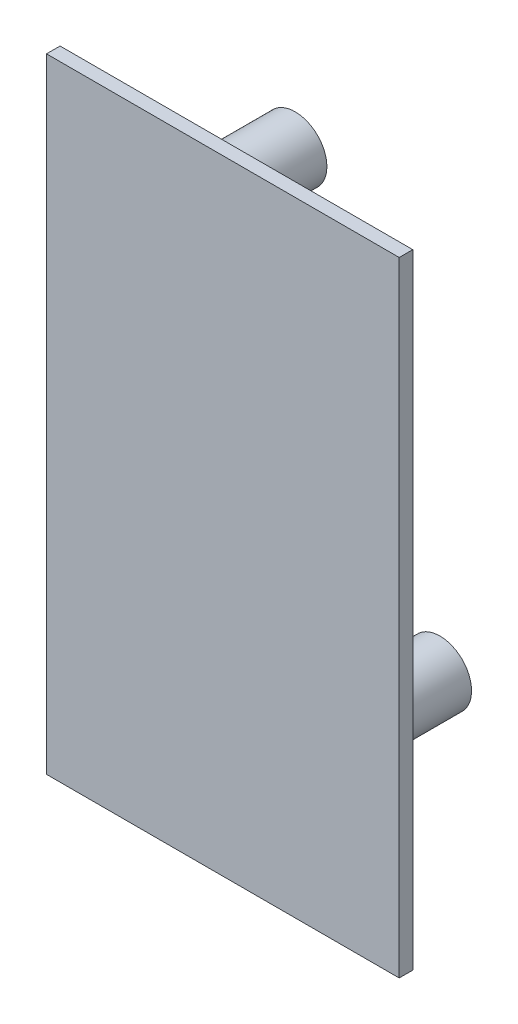
ISO-10303-21;
HEADER;
FILE_DESCRIPTION(('STEP AP214'),'2;1');
FILE_NAME('part.step','',(''),(''),'','','');
FILE_SCHEMA(('AUTOMOTIVE_DESIGN { 1 0 10303 214 1 1 1 1 }'));
ENDSEC;
DATA;
#1=APPLICATION_CONTEXT('core data for automotive mechanical design processes');
#2=APPLICATION_PROTOCOL_DEFINITION('international standard','automotive_design',2000,#1);
#3=PRODUCT_CONTEXT('',#1,'mechanical');
#4=PRODUCT('Part','Part','',(#3));
#5=PRODUCT_RELATED_PRODUCT_CATEGORY('part','',(#4));
#6=PRODUCT_DEFINITION_FORMATION('','',#4);
#7=PRODUCT_DEFINITION_CONTEXT('part definition',#1,'design');
#8=PRODUCT_DEFINITION('design','',#6,#7);
#9=PRODUCT_DEFINITION_SHAPE('','',#8);
#10=(LENGTH_UNIT() NAMED_UNIT(*) SI_UNIT(.MILLI.,.METRE.));
#11=(NAMED_UNIT(*) PLANE_ANGLE_UNIT() SI_UNIT($,.RADIAN.));
#12=(NAMED_UNIT(*) SI_UNIT($,.STERADIAN.) SOLID_ANGLE_UNIT());
#13=UNCERTAINTY_MEASURE_WITH_UNIT(LENGTH_MEASURE(1.E-05),#10,'distance_accuracy_value','');
#14=(GEOMETRIC_REPRESENTATION_CONTEXT(3) GLOBAL_UNCERTAINTY_ASSIGNED_CONTEXT((#13)) GLOBAL_UNIT_ASSIGNED_CONTEXT((#10,
#11,#12)) REPRESENTATION_CONTEXT('',''));
#15=CARTESIAN_POINT('',(0.,0.,0.));
#16=DIRECTION('',(0.,0.,1.));
#17=DIRECTION('',(1.,0.,0.));
#18=AXIS2_PLACEMENT_3D('',#15,#16,#17);
#19=CARTESIAN_POINT('',(0.,0.,1.5));
#20=DIRECTION('',(1.,0.,0.));
#21=DIRECTION('',(0.,1.,0.));
#22=AXIS2_PLACEMENT_3D('',#19,#20,#21);
#23=PLANE('',#22);
#24=DIRECTION('',(0.,-1.,0.));
#25=VECTOR('',#24,1.);
#26=CARTESIAN_POINT('',(0.,0.,0.));
#27=LINE('',#26,#25);
#28=CARTESIAN_POINT('',(0.,69.,0.));
#29=VERTEX_POINT('',#28);
#30=CARTESIAN_POINT('',(0.,0.,0.));
#31=VERTEX_POINT('',#30);
#32=EDGE_CURVE('E111',#29,#31,#27,.T.);
#33=ORIENTED_EDGE('',*,*,#32,.T.);
#34=DIRECTION('',(0.,0.,-1.));
#35=VECTOR('',#34,1.);
#36=CARTESIAN_POINT('',(0.,0.,1.5));
#37=LINE('',#36,#35);
#38=CARTESIAN_POINT('',(0.,0.,1.5));
#39=VERTEX_POINT('',#38);
#40=EDGE_CURVE('E100',#39,#31,#37,.T.);
#41=ORIENTED_EDGE('',*,*,#40,.F.);
#42=DIRECTION('',(0.,-1.,0.));
#43=VECTOR('',#42,1.);
#44=CARTESIAN_POINT('',(0.,0.,1.5));
#45=LINE('',#44,#43);
#46=CARTESIAN_POINT('',(0.,69.,1.5));
#47=VERTEX_POINT('',#46);
#48=EDGE_CURVE('E92',#47,#39,#45,.T.);
#49=ORIENTED_EDGE('',*,*,#48,.F.);
#50=DIRECTION('',(0.,0.,-1.));
#51=VECTOR('',#50,1.);
#52=CARTESIAN_POINT('',(0.,69.,1.5));
#53=LINE('',#52,#51);
#54=EDGE_CURVE('E107',#47,#29,#53,.T.);
#55=ORIENTED_EDGE('',*,*,#54,.T.);
#56=EDGE_LOOP('',(#33,#41,#49,#55));
#57=FACE_BOUND('',#56,.T.);
#58=ADVANCED_FACE('F39',(#57),#23,.F.);
#59=CARTESIAN_POINT('',(0.,0.,1.5));
#60=DIRECTION('',(0.,1.,0.));
#61=DIRECTION('',(0.,0.,1.));
#62=AXIS2_PLACEMENT_3D('',#59,#60,#61);
#63=PLANE('',#62);
#64=DIRECTION('',(1.,0.,0.));
#65=VECTOR('',#64,1.);
#66=CARTESIAN_POINT('',(0.,0.,0.));
#67=LINE('',#66,#65);
#68=CARTESIAN_POINT('',(39.,0.,0.));
#69=VERTEX_POINT('',#68);
#70=EDGE_CURVE('E98',#31,#69,#67,.T.);
#71=ORIENTED_EDGE('',*,*,#70,.T.);
#72=DIRECTION('',(0.,0.,-1.));
#73=VECTOR('',#72,1.);
#74=CARTESIAN_POINT('',(39.,0.,1.5));
#75=LINE('',#74,#73);
#76=CARTESIAN_POINT('',(39.,0.,1.5));
#77=VERTEX_POINT('',#76);
#78=EDGE_CURVE('E96',#77,#69,#75,.T.);
#79=ORIENTED_EDGE('',*,*,#78,.F.);
#80=DIRECTION('',(1.,0.,0.));
#81=VECTOR('',#80,1.);
#82=CARTESIAN_POINT('',(0.,0.,1.5));
#83=LINE('',#82,#81);
#84=EDGE_CURVE('E87',#39,#77,#83,.T.);
#85=ORIENTED_EDGE('',*,*,#84,.F.);
#86=ORIENTED_EDGE('',*,*,#40,.T.);
#87=EDGE_LOOP('',(#71,#79,#85,#86));
#88=FACE_BOUND('',#87,.T.);
#89=ADVANCED_FACE('F97',(#88),#63,.F.);
#90=CARTESIAN_POINT('',(39.,0.,1.5));
#91=DIRECTION('',(-1.,0.,0.));
#92=DIRECTION('',(0.,-1.,0.));
#93=AXIS2_PLACEMENT_3D('',#90,#91,#92);
#94=PLANE('',#93);
#95=DIRECTION('',(0.,1.,0.));
#96=VECTOR('',#95,1.);
#97=CARTESIAN_POINT('',(39.,0.,0.));
#98=LINE('',#97,#96);
#99=CARTESIAN_POINT('',(39.,69.,0.));
#100=VERTEX_POINT('',#99);
#101=EDGE_CURVE('E73',#69,#100,#98,.T.);
#102=ORIENTED_EDGE('',*,*,#101,.T.);
#103=DIRECTION('',(0.,0.,-1.));
#104=VECTOR('',#103,1.);
#105=CARTESIAN_POINT('',(39.,69.,1.5));
#106=LINE('',#105,#104);
#107=CARTESIAN_POINT('',(39.,69.,1.5));
#108=VERTEX_POINT('',#107);
#109=EDGE_CURVE('E101',#108,#100,#106,.T.);
#110=ORIENTED_EDGE('',*,*,#109,.F.);
#111=DIRECTION('',(0.,1.,0.));
#112=VECTOR('',#111,1.);
#113=CARTESIAN_POINT('',(39.,0.,1.5));
#114=LINE('',#113,#112);
#115=EDGE_CURVE('E90',#77,#108,#114,.T.);
#116=ORIENTED_EDGE('',*,*,#115,.F.);
#117=ORIENTED_EDGE('',*,*,#78,.T.);
#118=EDGE_LOOP('',(#102,#110,#116,#117));
#119=FACE_BOUND('',#118,.T.);
#120=ADVANCED_FACE('F103',(#119),#94,.F.);
#121=CARTESIAN_POINT('',(0.,69.,1.5));
#122=DIRECTION('',(0.,-1.,0.));
#123=DIRECTION('',(0.,0.,-1.));
#124=AXIS2_PLACEMENT_3D('',#121,#122,#123);
#125=PLANE('',#124);
#126=DIRECTION('',(-1.,0.,0.));
#127=VECTOR('',#126,1.);
#128=CARTESIAN_POINT('',(0.,69.,0.));
#129=LINE('',#128,#127);
#130=EDGE_CURVE('E79',#100,#29,#129,.T.);
#131=ORIENTED_EDGE('',*,*,#130,.T.);
#132=ORIENTED_EDGE('',*,*,#54,.F.);
#133=DIRECTION('',(-1.,0.,0.));
#134=VECTOR('',#133,1.);
#135=CARTESIAN_POINT('',(0.,69.,1.5));
#136=LINE('',#135,#134);
#137=EDGE_CURVE('E56',#108,#47,#136,.T.);
#138=ORIENTED_EDGE('',*,*,#137,.F.);
#139=ORIENTED_EDGE('',*,*,#109,.T.);
#140=EDGE_LOOP('',(#131,#132,#138,#139));
#141=FACE_BOUND('',#140,.T.);
#142=ADVANCED_FACE('F180',(#141),#125,.F.);
#143=CARTESIAN_POINT('',(0.,0.,1.5));
#144=DIRECTION('',(0.,0.,-1.));
#145=DIRECTION('',(-1.,0.,0.));
#146=AXIS2_PLACEMENT_3D('',#143,#144,#145);
#147=PLANE('',#146);
#148=ORIENTED_EDGE('',*,*,#48,.T.);
#149=ORIENTED_EDGE('',*,*,#84,.T.);
#150=ORIENTED_EDGE('',*,*,#115,.T.);
#151=ORIENTED_EDGE('',*,*,#137,.T.);
#152=EDGE_LOOP('',(#148,#149,#150,#151));
#153=FACE_BOUND('',#152,.T.);
#154=ADVANCED_FACE('F88',(#153),#147,.F.);
#155=CARTESIAN_POINT('',(0.,0.,0.));
#156=DIRECTION('',(0.,0.,-1.));
#157=DIRECTION('',(-1.,0.,0.));
#158=AXIS2_PLACEMENT_3D('',#155,#156,#157);
#159=PLANE('',#158);
#160=CARTESIAN_POINT('',(19.,12.2,0.));
#161=DIRECTION('',(0.,0.,-1.));
#162=DIRECTION('',(-1.,0.,0.));
#163=AXIS2_PLACEMENT_3D('',#160,#161,#162);
#164=CIRCLE('',#163,3.5);
#165=CARTESIAN_POINT('',(15.5,12.2,0.));
#166=VERTEX_POINT('',#165);
#167=EDGE_CURVE('E184',#166,#166,#164,.T.);
#168=ORIENTED_EDGE('',*,*,#167,.F.);
#169=EDGE_LOOP('',(#168));
#170=FACE_BOUND('',#169,.T.);
#171=CARTESIAN_POINT('',(35.,23.,0.));
#172=DIRECTION('',(0.,0.,-1.));
#173=DIRECTION('',(-1.,0.,0.));
#174=AXIS2_PLACEMENT_3D('',#171,#172,#173);
#175=CIRCLE('',#174,3.5);
#176=CARTESIAN_POINT('',(31.5,23.,0.));
#177=VERTEX_POINT('',#176);
#178=EDGE_CURVE('E188',#177,#177,#175,.T.);
#179=ORIENTED_EDGE('',*,*,#178,.F.);
#180=EDGE_LOOP('',(#179));
#181=FACE_BOUND('',#180,.T.);
#182=CARTESIAN_POINT('',(19.,65.2,0.));
#183=DIRECTION('',(0.,0.,-1.));
#184=DIRECTION('',(-1.,0.,0.));
#185=AXIS2_PLACEMENT_3D('',#182,#183,#184);
#186=CIRCLE('',#185,3.5);
#187=CARTESIAN_POINT('',(15.5,65.2,0.));
#188=VERTEX_POINT('',#187);
#189=EDGE_CURVE('E191',#188,#188,#186,.T.);
#190=ORIENTED_EDGE('',*,*,#189,.F.);
#191=EDGE_LOOP('',(#190));
#192=FACE_BOUND('',#191,.T.);
#193=ORIENTED_EDGE('',*,*,#32,.F.);
#194=ORIENTED_EDGE('',*,*,#130,.F.);
#195=ORIENTED_EDGE('',*,*,#101,.F.);
#196=ORIENTED_EDGE('',*,*,#70,.F.);
#197=EDGE_LOOP('',(#193,#194,#195,#196));
#198=FACE_BOUND('',#197,.T.);
#199=ADVANCED_FACE('F153',(#170,#181,#192,#198),#159,.T.);
#200=CARTESIAN_POINT('',(19.,65.2,-7.));
#201=DIRECTION('',(0.,0.,-1.));
#202=DIRECTION('',(-1.,0.,0.));
#203=AXIS2_PLACEMENT_3D('',#200,#201,#202);
#204=PLANE('',#203);
#205=CARTESIAN_POINT('',(19.,65.2,-7.));
#206=DIRECTION('',(0.,0.,-1.));
#207=DIRECTION('',(-1.,0.,0.));
#208=AXIS2_PLACEMENT_3D('',#205,#206,#207);
#209=CIRCLE('',#208,3.5);
#210=CARTESIAN_POINT('',(15.5,65.2,-7.));
#211=VERTEX_POINT('',#210);
#212=EDGE_CURVE('E115',#211,#211,#209,.T.);
#213=ORIENTED_EDGE('',*,*,#212,.T.);
#214=EDGE_LOOP('',(#213));
#215=FACE_BOUND('',#214,.T.);
#216=CARTESIAN_POINT('',(19.,65.2,-7.));
#217=DIRECTION('',(0.,0.,-1.));
#218=DIRECTION('',(-1.,0.,0.));
#219=AXIS2_PLACEMENT_3D('',#216,#217,#218);
#220=CIRCLE('',#219,1.5);
#221=CARTESIAN_POINT('',(17.5,65.2,-7.));
#222=VERTEX_POINT('',#221);
#223=EDGE_CURVE('E194',#222,#222,#220,.T.);
#224=ORIENTED_EDGE('',*,*,#223,.F.);
#225=EDGE_LOOP('',(#224));
#226=FACE_BOUND('',#225,.T.);
#227=ADVANCED_FACE('F171',(#215,#226),#204,.T.);
#228=CARTESIAN_POINT('',(19.,65.2,-7.));
#229=DIRECTION('',(0.,0.,1.));
#230=DIRECTION('',(1.,0.,0.));
#231=AXIS2_PLACEMENT_3D('',#228,#229,#230);
#232=CYLINDRICAL_SURFACE('',#231,3.5);
#233=ORIENTED_EDGE('',*,*,#212,.F.);
#234=EDGE_LOOP('',(#233));
#235=FACE_BOUND('',#234,.T.);
#236=ORIENTED_EDGE('',*,*,#189,.T.);
#237=EDGE_LOOP('',(#236));
#238=FACE_BOUND('',#237,.T.);
#239=ADVANCED_FACE('F177',(#235,#238),#232,.T.);
#240=CARTESIAN_POINT('',(19.,65.2,-7.));
#241=DIRECTION('',(0.,0.,1.));
#242=DIRECTION('',(1.,0.,0.));
#243=AXIS2_PLACEMENT_3D('',#240,#241,#242);
#244=CYLINDRICAL_SURFACE('',#243,1.5);
#245=ORIENTED_EDGE('',*,*,#223,.T.);
#246=EDGE_LOOP('',(#245));
#247=FACE_BOUND('',#246,.T.);
#248=CARTESIAN_POINT('',(19.,65.2,0.));
#249=DIRECTION('',(0.,0.,-1.));
#250=DIRECTION('',(-1.,0.,0.));
#251=AXIS2_PLACEMENT_3D('',#248,#249,#250);
#252=CIRCLE('',#251,1.5);
#253=CARTESIAN_POINT('',(17.5,65.2,0.));
#254=VERTEX_POINT('',#253);
#255=EDGE_CURVE('E128',#254,#254,#252,.F.);
#256=ORIENTED_EDGE('',*,*,#255,.T.);
#257=EDGE_LOOP('',(#256));
#258=FACE_BOUND('',#257,.T.);
#259=ADVANCED_FACE('F158',(#247,#258),#244,.F.);
#260=ORIENTED_EDGE('',*,*,#255,.F.);
#261=EDGE_LOOP('',(#260));
#262=FACE_BOUND('',#261,.T.);
#263=ADVANCED_FACE('F141',(#262),#159,.T.);
#264=CARTESIAN_POINT('',(35.,23.,-7.));
#265=DIRECTION('',(0.,0.,-1.));
#266=DIRECTION('',(-1.,0.,0.));
#267=AXIS2_PLACEMENT_3D('',#264,#265,#266);
#268=PLANE('',#267);
#269=CARTESIAN_POINT('',(35.,23.,-7.));
#270=DIRECTION('',(0.,0.,-1.));
#271=DIRECTION('',(-1.,0.,0.));
#272=AXIS2_PLACEMENT_3D('',#269,#270,#271);
#273=CIRCLE('',#272,3.5);
#274=CARTESIAN_POINT('',(31.5,23.,-7.));
#275=VERTEX_POINT('',#274);
#276=EDGE_CURVE('E201',#275,#275,#273,.T.);
#277=ORIENTED_EDGE('',*,*,#276,.T.);
#278=EDGE_LOOP('',(#277));
#279=FACE_BOUND('',#278,.T.);
#280=CARTESIAN_POINT('',(35.,23.,-7.));
#281=DIRECTION('',(0.,0.,-1.));
#282=DIRECTION('',(-1.,0.,0.));
#283=AXIS2_PLACEMENT_3D('',#280,#281,#282);
#284=CIRCLE('',#283,1.5);
#285=CARTESIAN_POINT('',(33.5,23.,-7.));
#286=VERTEX_POINT('',#285);
#287=EDGE_CURVE('E207',#286,#286,#284,.T.);
#288=ORIENTED_EDGE('',*,*,#287,.F.);
#289=EDGE_LOOP('',(#288));
#290=FACE_BOUND('',#289,.T.);
#291=ADVANCED_FACE('F157',(#279,#290),#268,.T.);
#292=CARTESIAN_POINT('',(35.,23.,-7.));
#293=DIRECTION('',(0.,0.,1.));
#294=DIRECTION('',(1.,0.,0.));
#295=AXIS2_PLACEMENT_3D('',#292,#293,#294);
#296=CYLINDRICAL_SURFACE('',#295,3.5);
#297=ORIENTED_EDGE('',*,*,#276,.F.);
#298=EDGE_LOOP('',(#297));
#299=FACE_BOUND('',#298,.T.);
#300=ORIENTED_EDGE('',*,*,#178,.T.);
#301=EDGE_LOOP('',(#300));
#302=FACE_BOUND('',#301,.T.);
#303=ADVANCED_FACE('F150',(#299,#302),#296,.T.);
#304=CARTESIAN_POINT('',(35.,23.,-7.));
#305=DIRECTION('',(0.,0.,1.));
#306=DIRECTION('',(1.,0.,0.));
#307=AXIS2_PLACEMENT_3D('',#304,#305,#306);
#308=CYLINDRICAL_SURFACE('',#307,1.5);
#309=ORIENTED_EDGE('',*,*,#287,.T.);
#310=EDGE_LOOP('',(#309));
#311=FACE_BOUND('',#310,.T.);
#312=CARTESIAN_POINT('',(35.,23.,0.));
#313=DIRECTION('',(0.,0.,-1.));
#314=DIRECTION('',(-1.,0.,0.));
#315=AXIS2_PLACEMENT_3D('',#312,#313,#314);
#316=CIRCLE('',#315,1.5);
#317=CARTESIAN_POINT('',(33.5,23.,0.));
#318=VERTEX_POINT('',#317);
#319=EDGE_CURVE('E48',#318,#318,#316,.F.);
#320=ORIENTED_EDGE('',*,*,#319,.T.);
#321=EDGE_LOOP('',(#320));
#322=FACE_BOUND('',#321,.T.);
#323=ADVANCED_FACE('F135',(#311,#322),#308,.F.);
#324=ORIENTED_EDGE('',*,*,#319,.F.);
#325=EDGE_LOOP('',(#324));
#326=FACE_BOUND('',#325,.T.);
#327=ADVANCED_FACE('F137',(#326),#159,.T.);
#328=CARTESIAN_POINT('',(19.,12.2,-7.));
#329=DIRECTION('',(0.,0.,-1.));
#330=DIRECTION('',(-1.,0.,0.));
#331=AXIS2_PLACEMENT_3D('',#328,#329,#330);
#332=PLANE('',#331);
#333=CARTESIAN_POINT('',(19.,12.2,-7.));
#334=DIRECTION('',(0.,0.,-1.));
#335=DIRECTION('',(-1.,0.,0.));
#336=AXIS2_PLACEMENT_3D('',#333,#334,#335);
#337=CIRCLE('',#336,3.5);
#338=CARTESIAN_POINT('',(15.5,12.2,-7.));
#339=VERTEX_POINT('',#338);
#340=EDGE_CURVE('E214',#339,#339,#337,.T.);
#341=ORIENTED_EDGE('',*,*,#340,.T.);
#342=EDGE_LOOP('',(#341));
#343=FACE_BOUND('',#342,.T.);
#344=CARTESIAN_POINT('',(19.,12.2,-7.));
#345=DIRECTION('',(0.,0.,-1.));
#346=DIRECTION('',(-1.,0.,0.));
#347=AXIS2_PLACEMENT_3D('',#344,#345,#346);
#348=CIRCLE('',#347,1.5);
#349=CARTESIAN_POINT('',(17.5,12.2,-7.));
#350=VERTEX_POINT('',#349);
#351=EDGE_CURVE('E217',#350,#350,#348,.T.);
#352=ORIENTED_EDGE('',*,*,#351,.F.);
#353=EDGE_LOOP('',(#352));
#354=FACE_BOUND('',#353,.T.);
#355=ADVANCED_FACE('F139',(#343,#354),#332,.T.);
#356=CARTESIAN_POINT('',(19.,12.2,-7.));
#357=DIRECTION('',(0.,0.,1.));
#358=DIRECTION('',(1.,0.,0.));
#359=AXIS2_PLACEMENT_3D('',#356,#357,#358);
#360=CYLINDRICAL_SURFACE('',#359,3.5);
#361=ORIENTED_EDGE('',*,*,#340,.F.);
#362=EDGE_LOOP('',(#361));
#363=FACE_BOUND('',#362,.T.);
#364=ORIENTED_EDGE('',*,*,#167,.T.);
#365=EDGE_LOOP('',(#364));
#366=FACE_BOUND('',#365,.T.);
#367=ADVANCED_FACE('F147',(#363,#366),#360,.T.);
#368=CARTESIAN_POINT('',(19.,12.2,-7.));
#369=DIRECTION('',(0.,0.,1.));
#370=DIRECTION('',(1.,0.,0.));
#371=AXIS2_PLACEMENT_3D('',#368,#369,#370);
#372=CYLINDRICAL_SURFACE('',#371,1.5);
#373=ORIENTED_EDGE('',*,*,#351,.T.);
#374=EDGE_LOOP('',(#373));
#375=FACE_BOUND('',#374,.T.);
#376=CARTESIAN_POINT('',(19.,12.2,0.));
#377=DIRECTION('',(0.,0.,-1.));
#378=DIRECTION('',(-1.,0.,0.));
#379=AXIS2_PLACEMENT_3D('',#376,#377,#378);
#380=CIRCLE('',#379,1.5);
#381=CARTESIAN_POINT('',(17.5,12.2,0.));
#382=VERTEX_POINT('',#381);
#383=EDGE_CURVE('E11',#382,#382,#380,.F.);
#384=ORIENTED_EDGE('',*,*,#383,.T.);
#385=EDGE_LOOP('',(#384));
#386=FACE_BOUND('',#385,.T.);
#387=ADVANCED_FACE('F161',(#375,#386),#372,.F.);
#388=ORIENTED_EDGE('',*,*,#383,.F.);
#389=EDGE_LOOP('',(#388));
#390=FACE_BOUND('',#389,.T.);
#391=ADVANCED_FACE('F142',(#390),#159,.T.);
#392=CLOSED_SHELL('',(#58,#89,#120,#142,#154,#199,#227,#239,#259,#263,#291,#303,#323,#327,#355,
#367,#387,#391));
#393=MANIFOLD_SOLID_BREP('B2',#392);
#394=ADVANCED_BREP_SHAPE_REPRESENTATION('',(#18,#393),#14);
#395=SHAPE_DEFINITION_REPRESENTATION(#9,#394);
ENDSEC;
END-ISO-10303-21;
